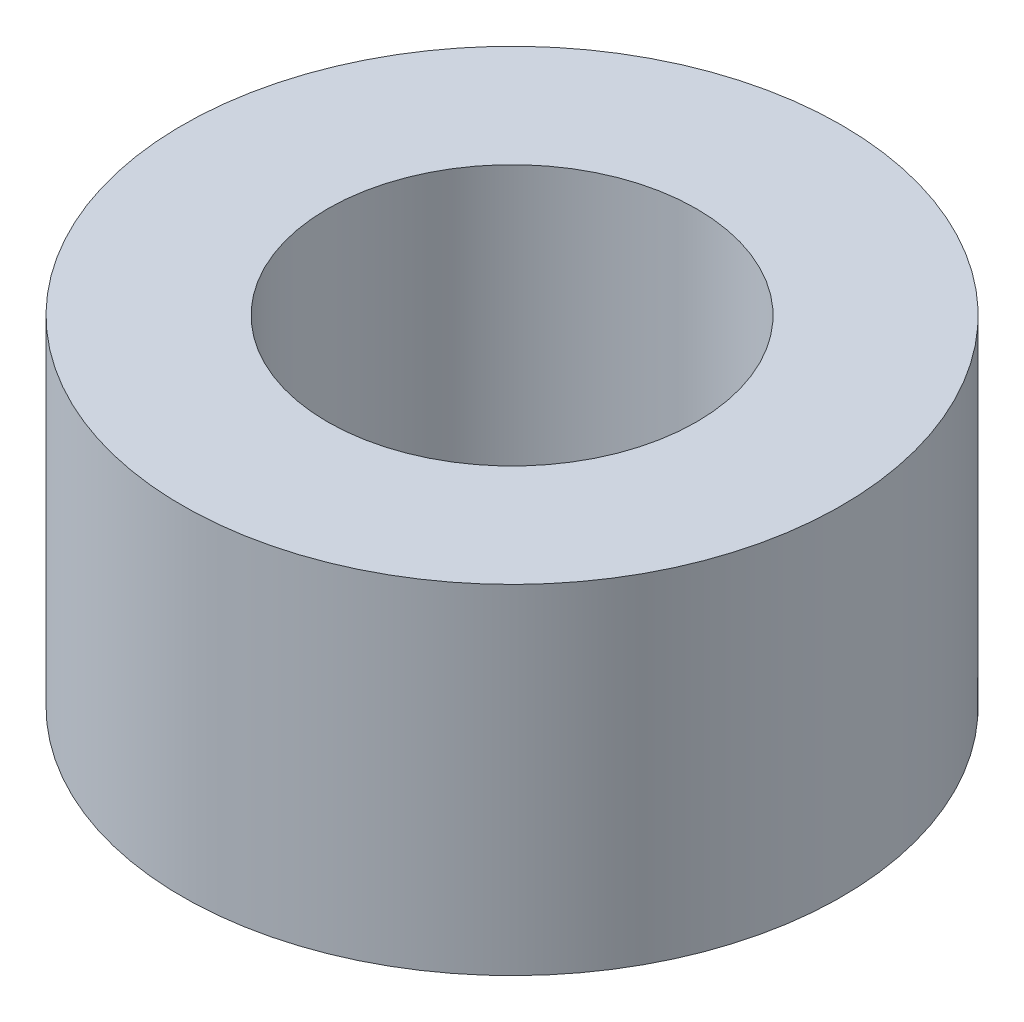
ISO-10303-21;
HEADER;
FILE_DESCRIPTION(('STEP AP214'),'2;1');
FILE_NAME('part.step','',(''),(''),'','','');
FILE_SCHEMA(('AUTOMOTIVE_DESIGN { 1 0 10303 214 1 1 1 1 }'));
ENDSEC;
DATA;
#1=APPLICATION_CONTEXT('core data for automotive mechanical design processes');
#2=APPLICATION_PROTOCOL_DEFINITION('international standard','automotive_design',2000,#1);
#3=PRODUCT_CONTEXT('',#1,'mechanical');
#4=PRODUCT('Part','Part','',(#3));
#5=PRODUCT_RELATED_PRODUCT_CATEGORY('part','',(#4));
#6=PRODUCT_DEFINITION_FORMATION('','',#4);
#7=PRODUCT_DEFINITION_CONTEXT('part definition',#1,'design');
#8=PRODUCT_DEFINITION('design','',#6,#7);
#9=PRODUCT_DEFINITION_SHAPE('','',#8);
#10=(LENGTH_UNIT() NAMED_UNIT(*) SI_UNIT(.MILLI.,.METRE.));
#11=(NAMED_UNIT(*) PLANE_ANGLE_UNIT() SI_UNIT($,.RADIAN.));
#12=(NAMED_UNIT(*) SI_UNIT($,.STERADIAN.) SOLID_ANGLE_UNIT());
#13=UNCERTAINTY_MEASURE_WITH_UNIT(LENGTH_MEASURE(1.E-05),#10,'distance_accuracy_value','');
#14=(GEOMETRIC_REPRESENTATION_CONTEXT(3) GLOBAL_UNCERTAINTY_ASSIGNED_CONTEXT((#13)) GLOBAL_UNIT_ASSIGNED_CONTEXT((#10,
#11,#12)) REPRESENTATION_CONTEXT('',''));
#15=CARTESIAN_POINT('',(0.,0.,0.));
#16=DIRECTION('',(0.,0.,1.));
#17=DIRECTION('',(1.,0.,0.));
#18=AXIS2_PLACEMENT_3D('',#15,#16,#17);
#19=CARTESIAN_POINT('',(0.,3.2639,0.));
#20=DIRECTION('',(0.,1.,0.));
#21=DIRECTION('',(0.,0.,1.));
#22=AXIS2_PLACEMENT_3D('',#19,#20,#21);
#23=PLANE('',#22);
#24=CARTESIAN_POINT('',(0.,3.2639,0.));
#25=DIRECTION('',(0.,1.,0.));
#26=DIRECTION('',(0.,0.,1.));
#27=AXIS2_PLACEMENT_3D('',#24,#25,#26);
#28=CIRCLE('',#27,3.175);
#29=CARTESIAN_POINT('',(0.,3.2639,-3.175));
#30=VERTEX_POINT('',#29);
#31=EDGE_CURVE('E10',#30,#30,#28,.T.);
#32=ORIENTED_EDGE('',*,*,#31,.T.);
#33=EDGE_LOOP('',(#32));
#34=FACE_BOUND('',#33,.T.);
#35=CARTESIAN_POINT('',(0.,3.2639,0.));
#36=DIRECTION('',(0.,1.,0.));
#37=DIRECTION('',(0.,0.,1.));
#38=AXIS2_PLACEMENT_3D('',#35,#36,#37);
#39=CIRCLE('',#38,1.778);
#40=CARTESIAN_POINT('',(0.,3.2639,-1.778));
#41=VERTEX_POINT('',#40);
#42=EDGE_CURVE('E44',#41,#41,#39,.T.);
#43=ORIENTED_EDGE('',*,*,#42,.F.);
#44=EDGE_LOOP('',(#43));
#45=FACE_BOUND('',#44,.T.);
#46=ADVANCED_FACE('F33',(#34,#45),#23,.T.);
#47=CARTESIAN_POINT('',(0.,0.,0.));
#48=DIRECTION('',(0.,1.,0.));
#49=DIRECTION('',(0.,0.,1.));
#50=AXIS2_PLACEMENT_3D('',#47,#48,#49);
#51=PLANE('',#50);
#52=CARTESIAN_POINT('',(0.,0.,0.));
#53=DIRECTION('',(0.,1.,0.));
#54=DIRECTION('',(0.,0.,1.));
#55=AXIS2_PLACEMENT_3D('',#52,#53,#54);
#56=CIRCLE('',#55,3.175);
#57=CARTESIAN_POINT('',(0.,0.,-3.175));
#58=VERTEX_POINT('',#57);
#59=EDGE_CURVE('E37',#58,#58,#56,.T.);
#60=ORIENTED_EDGE('',*,*,#59,.F.);
#61=EDGE_LOOP('',(#60));
#62=FACE_BOUND('',#61,.T.);
#63=CARTESIAN_POINT('',(0.,0.,0.));
#64=DIRECTION('',(0.,1.,0.));
#65=DIRECTION('',(0.,0.,1.));
#66=AXIS2_PLACEMENT_3D('',#63,#64,#65);
#67=CIRCLE('',#66,1.778);
#68=CARTESIAN_POINT('',(0.,0.,-1.778));
#69=VERTEX_POINT('',#68);
#70=EDGE_CURVE('E46',#69,#69,#67,.T.);
#71=ORIENTED_EDGE('',*,*,#70,.T.);
#72=EDGE_LOOP('',(#71));
#73=FACE_BOUND('',#72,.T.);
#74=ADVANCED_FACE('F56',(#62,#73),#51,.F.);
#75=CARTESIAN_POINT('',(0.,3.2639,0.));
#76=DIRECTION('',(0.,-1.,0.));
#77=DIRECTION('',(0.,0.,-1.));
#78=AXIS2_PLACEMENT_3D('',#75,#76,#77);
#79=CYLINDRICAL_SURFACE('',#78,3.175);
#80=CARTESIAN_POINT('',(0.,3.2639,-3.175));
#81=CARTESIAN_POINT('',(0.,3.22990104166667,-3.175));
#82=CARTESIAN_POINT('',(0.,3.19590208333333,-3.175));
#83=CARTESIAN_POINT('',(0.,3.12790416666667,-3.175));
#84=CARTESIAN_POINT('',(0.,3.09390520833333,-3.175));
#85=CARTESIAN_POINT('',(0.,3.02590729166667,-3.175));
#86=CARTESIAN_POINT('',(0.,2.99190833333333,-3.175));
#87=CARTESIAN_POINT('',(0.,2.92391041666667,-3.175));
#88=CARTESIAN_POINT('',(0.,2.88991145833333,-3.175));
#89=CARTESIAN_POINT('',(0.,2.82191354166667,-3.175));
#90=CARTESIAN_POINT('',(0.,2.78791458333333,-3.175));
#91=CARTESIAN_POINT('',(0.,2.71991666666667,-3.175));
#92=CARTESIAN_POINT('',(0.,2.68591770833333,-3.175));
#93=CARTESIAN_POINT('',(0.,2.61791979166667,-3.175));
#94=CARTESIAN_POINT('',(0.,2.58392083333333,-3.175));
#95=CARTESIAN_POINT('',(0.,2.51592291666667,-3.175));
#96=CARTESIAN_POINT('',(0.,2.48192395833333,-3.175));
#97=CARTESIAN_POINT('',(0.,2.41392604166667,-3.175));
#98=CARTESIAN_POINT('',(0.,2.37992708333333,-3.175));
#99=CARTESIAN_POINT('',(0.,2.31192916666667,-3.175));
#100=CARTESIAN_POINT('',(0.,2.27793020833333,-3.175));
#101=CARTESIAN_POINT('',(0.,2.20993229166667,-3.175));
#102=CARTESIAN_POINT('',(0.,2.17593333333333,-3.175));
#103=CARTESIAN_POINT('',(0.,2.10793541666667,-3.175));
#104=CARTESIAN_POINT('',(0.,2.07393645833333,-3.175));
#105=CARTESIAN_POINT('',(0.,2.00593854166667,-3.175));
#106=CARTESIAN_POINT('',(0.,1.97193958333333,-3.175));
#107=CARTESIAN_POINT('',(0.,1.90394166666667,-3.175));
#108=CARTESIAN_POINT('',(0.,1.86994270833333,-3.175));
#109=CARTESIAN_POINT('',(0.,1.80194479166667,-3.175));
#110=CARTESIAN_POINT('',(0.,1.76794583333333,-3.175));
#111=CARTESIAN_POINT('',(0.,1.69994791666667,-3.175));
#112=CARTESIAN_POINT('',(0.,1.66594895833333,-3.175));
#113=CARTESIAN_POINT('',(0.,1.59795104166667,-3.175));
#114=CARTESIAN_POINT('',(0.,1.56395208333333,-3.175));
#115=CARTESIAN_POINT('',(0.,1.49595416666667,-3.175));
#116=CARTESIAN_POINT('',(0.,1.46195520833333,-3.175));
#117=CARTESIAN_POINT('',(0.,1.39395729166667,-3.175));
#118=CARTESIAN_POINT('',(0.,1.35995833333333,-3.175));
#119=CARTESIAN_POINT('',(0.,1.29196041666667,-3.175));
#120=CARTESIAN_POINT('',(0.,1.25796145833333,-3.175));
#121=CARTESIAN_POINT('',(0.,1.18996354166667,-3.175));
#122=CARTESIAN_POINT('',(0.,1.15596458333333,-3.175));
#123=CARTESIAN_POINT('',(0.,1.08796666666667,-3.175));
#124=CARTESIAN_POINT('',(0.,1.05396770833333,-3.175));
#125=CARTESIAN_POINT('',(0.,0.985969791666667,-3.175));
#126=CARTESIAN_POINT('',(0.,0.951970833333333,-3.175));
#127=CARTESIAN_POINT('',(0.,0.883972916666667,-3.175));
#128=CARTESIAN_POINT('',(0.,0.849973958333333,-3.175));
#129=CARTESIAN_POINT('',(0.,0.781976041666666,-3.175));
#130=CARTESIAN_POINT('',(0.,0.747977083333333,-3.175));
#131=CARTESIAN_POINT('',(0.,0.679979166666666,-3.175));
#132=CARTESIAN_POINT('',(0.,0.645980208333333,-3.175));
#133=CARTESIAN_POINT('',(0.,0.577982291666666,-3.175));
#134=CARTESIAN_POINT('',(0.,0.543983333333333,-3.175));
#135=CARTESIAN_POINT('',(0.,0.475985416666666,-3.175));
#136=CARTESIAN_POINT('',(0.,0.441986458333333,-3.175));
#137=CARTESIAN_POINT('',(0.,0.373988541666666,-3.175));
#138=CARTESIAN_POINT('',(0.,0.339989583333333,-3.175));
#139=CARTESIAN_POINT('',(0.,0.271991666666666,-3.175));
#140=CARTESIAN_POINT('',(0.,0.237992708333333,-3.175));
#141=CARTESIAN_POINT('',(0.,0.169994791666666,-3.175));
#142=CARTESIAN_POINT('',(0.,0.135995833333333,-3.175));
#143=CARTESIAN_POINT('',(0.,0.0679979166666662,-3.175));
#144=CARTESIAN_POINT('',(0.,0.0339989583333328,-3.175));
#145=CARTESIAN_POINT('',(0.,0.,-3.175));
#146=B_SPLINE_CURVE_WITH_KNOTS('',3,(#80,#81,#82,#83,#84,#85,#86,#87,#88,#89,#90,#91,#92,#93,
#94,#95,#96,#97,#98,#99,#100,#101,#102,#103,#104,#105,#106,#107,#108,#109,#110,#111,#112,#113,
#114,#115,#116,#117,#118,#119,#120,#121,#122,#123,#124,#125,#126,#127,#128,#129,#130,#131,#132,
#133,#134,#135,#136,#137,#138,#139,#140,#141,#142,#143,#144,#145),.UNSPECIFIED.,.F.,.F.,(4,2,2,
2,2,2,2,2,2,2,2,2,2,2,2,2,2,2,2,2,2,2,2,2,2,2,2,2,2,2,2,2,4),(0.,0.101996875,0.20399375,
0.305990625,0.4079875,0.509984375,0.61198125,0.713978125,0.815975,0.917971875,1.01996875,
1.121965625,1.2239625,1.325959375,1.42795625,1.529953125,1.63195,1.733946875,1.83594375,
1.937940625,2.0399375,2.141934375,2.24393125,2.345928125,2.447925,2.549921875,2.65191875,
2.753915625,2.8559125,2.957909375,3.05990625,3.161903125,3.2639),.UNSPECIFIED.);
#147=EDGE_CURVE('BSEAM35',#30,#58,#146,.T.);
#148=ORIENTED_EDGE('',*,*,#31,.F.);
#149=ORIENTED_EDGE('',*,*,#59,.T.);
#150=ORIENTED_EDGE('',*,*,#147,.T.);
#151=ORIENTED_EDGE('',*,*,#147,.F.);
#152=EDGE_LOOP('',(#148,#150,#149,#151));
#153=FACE_BOUND('',#152,.T.);
#154=ADVANCED_FACE('F35',(#153),#79,.T.);
#155=CARTESIAN_POINT('',(0.,3.2639,0.));
#156=DIRECTION('',(0.,-1.,0.));
#157=DIRECTION('',(0.,0.,-1.));
#158=AXIS2_PLACEMENT_3D('',#155,#156,#157);
#159=CYLINDRICAL_SURFACE('',#158,1.778);
#160=CARTESIAN_POINT('',(0.,3.2639,-1.778));
#161=CARTESIAN_POINT('',(0.,3.22990104166667,-1.778));
#162=CARTESIAN_POINT('',(0.,3.19590208333333,-1.778));
#163=CARTESIAN_POINT('',(0.,3.12790416666667,-1.778));
#164=CARTESIAN_POINT('',(0.,3.09390520833333,-1.778));
#165=CARTESIAN_POINT('',(0.,3.02590729166667,-1.778));
#166=CARTESIAN_POINT('',(0.,2.99190833333333,-1.778));
#167=CARTESIAN_POINT('',(0.,2.92391041666667,-1.778));
#168=CARTESIAN_POINT('',(0.,2.88991145833333,-1.778));
#169=CARTESIAN_POINT('',(0.,2.82191354166667,-1.778));
#170=CARTESIAN_POINT('',(0.,2.78791458333333,-1.778));
#171=CARTESIAN_POINT('',(0.,2.71991666666667,-1.778));
#172=CARTESIAN_POINT('',(0.,2.68591770833333,-1.778));
#173=CARTESIAN_POINT('',(0.,2.61791979166667,-1.778));
#174=CARTESIAN_POINT('',(0.,2.58392083333333,-1.778));
#175=CARTESIAN_POINT('',(0.,2.51592291666667,-1.778));
#176=CARTESIAN_POINT('',(0.,2.48192395833333,-1.778));
#177=CARTESIAN_POINT('',(0.,2.41392604166667,-1.778));
#178=CARTESIAN_POINT('',(0.,2.37992708333333,-1.778));
#179=CARTESIAN_POINT('',(0.,2.31192916666667,-1.778));
#180=CARTESIAN_POINT('',(0.,2.27793020833333,-1.778));
#181=CARTESIAN_POINT('',(0.,2.20993229166667,-1.778));
#182=CARTESIAN_POINT('',(0.,2.17593333333333,-1.778));
#183=CARTESIAN_POINT('',(0.,2.10793541666667,-1.778));
#184=CARTESIAN_POINT('',(0.,2.07393645833333,-1.778));
#185=CARTESIAN_POINT('',(0.,2.00593854166667,-1.778));
#186=CARTESIAN_POINT('',(0.,1.97193958333333,-1.778));
#187=CARTESIAN_POINT('',(0.,1.90394166666667,-1.778));
#188=CARTESIAN_POINT('',(0.,1.86994270833333,-1.778));
#189=CARTESIAN_POINT('',(0.,1.80194479166667,-1.778));
#190=CARTESIAN_POINT('',(0.,1.76794583333333,-1.778));
#191=CARTESIAN_POINT('',(0.,1.69994791666667,-1.778));
#192=CARTESIAN_POINT('',(0.,1.66594895833333,-1.778));
#193=CARTESIAN_POINT('',(0.,1.59795104166667,-1.778));
#194=CARTESIAN_POINT('',(0.,1.56395208333333,-1.778));
#195=CARTESIAN_POINT('',(0.,1.49595416666667,-1.778));
#196=CARTESIAN_POINT('',(0.,1.46195520833333,-1.778));
#197=CARTESIAN_POINT('',(0.,1.39395729166667,-1.778));
#198=CARTESIAN_POINT('',(0.,1.35995833333333,-1.778));
#199=CARTESIAN_POINT('',(0.,1.29196041666667,-1.778));
#200=CARTESIAN_POINT('',(0.,1.25796145833333,-1.778));
#201=CARTESIAN_POINT('',(0.,1.18996354166667,-1.778));
#202=CARTESIAN_POINT('',(0.,1.15596458333333,-1.778));
#203=CARTESIAN_POINT('',(0.,1.08796666666667,-1.778));
#204=CARTESIAN_POINT('',(0.,1.05396770833333,-1.778));
#205=CARTESIAN_POINT('',(0.,0.985969791666667,-1.778));
#206=CARTESIAN_POINT('',(0.,0.951970833333333,-1.778));
#207=CARTESIAN_POINT('',(0.,0.883972916666667,-1.778));
#208=CARTESIAN_POINT('',(0.,0.849973958333333,-1.778));
#209=CARTESIAN_POINT('',(0.,0.781976041666666,-1.778));
#210=CARTESIAN_POINT('',(0.,0.747977083333333,-1.778));
#211=CARTESIAN_POINT('',(0.,0.679979166666666,-1.778));
#212=CARTESIAN_POINT('',(0.,0.645980208333333,-1.778));
#213=CARTESIAN_POINT('',(0.,0.577982291666666,-1.778));
#214=CARTESIAN_POINT('',(0.,0.543983333333333,-1.778));
#215=CARTESIAN_POINT('',(0.,0.475985416666666,-1.778));
#216=CARTESIAN_POINT('',(0.,0.441986458333333,-1.778));
#217=CARTESIAN_POINT('',(0.,0.373988541666666,-1.778));
#218=CARTESIAN_POINT('',(0.,0.339989583333333,-1.778));
#219=CARTESIAN_POINT('',(0.,0.271991666666666,-1.778));
#220=CARTESIAN_POINT('',(0.,0.237992708333333,-1.778));
#221=CARTESIAN_POINT('',(0.,0.169994791666666,-1.778));
#222=CARTESIAN_POINT('',(0.,0.135995833333333,-1.778));
#223=CARTESIAN_POINT('',(0.,0.0679979166666662,-1.778));
#224=CARTESIAN_POINT('',(0.,0.0339989583333328,-1.778));
#225=CARTESIAN_POINT('',(0.,0.,-1.778));
#226=B_SPLINE_CURVE_WITH_KNOTS('',3,(#160,#161,#162,#163,#164,#165,#166,#167,#168,#169,#170,
#171,#172,#173,#174,#175,#176,#177,#178,#179,#180,#181,#182,#183,#184,#185,#186,#187,#188,#189,
#190,#191,#192,#193,#194,#195,#196,#197,#198,#199,#200,#201,#202,#203,#204,#205,#206,#207,#208,
#209,#210,#211,#212,#213,#214,#215,#216,#217,#218,#219,#220,#221,#222,#223,#224,#225),
.UNSPECIFIED.,.F.,.F.,(4,2,2,2,2,2,2,2,2,2,2,2,2,2,2,2,2,2,2,2,2,2,2,2,2,2,2,2,2,2,2,2,4),(0.,
0.101996875,0.20399375,0.305990625,0.4079875,0.509984375,0.61198125,0.713978125,0.815975,
0.917971875,1.01996875,1.121965625,1.2239625,1.325959375,1.42795625,1.529953125,1.63195,
1.733946875,1.83594375,1.937940625,2.0399375,2.141934375,2.24393125,2.345928125,2.447925,
2.549921875,2.65191875,2.753915625,2.8559125,2.957909375,3.05990625,3.161903125,3.2639),.UNSPECIFIED.);
#227=EDGE_CURVE('BSEAM52',#41,#69,#226,.T.);
#228=ORIENTED_EDGE('',*,*,#42,.T.);
#229=ORIENTED_EDGE('',*,*,#70,.F.);
#230=ORIENTED_EDGE('',*,*,#227,.T.);
#231=ORIENTED_EDGE('',*,*,#227,.F.);
#232=EDGE_LOOP('',(#228,#230,#229,#231));
#233=FACE_BOUND('',#232,.T.);
#234=ADVANCED_FACE('F52',(#233),#159,.F.);
#235=CLOSED_SHELL('',(#46,#74,#154,#234));
#236=MANIFOLD_SOLID_BREP('B2',#235);
#237=ADVANCED_BREP_SHAPE_REPRESENTATION('',(#18,#236),#14);
#238=SHAPE_DEFINITION_REPRESENTATION(#9,#237);
ENDSEC;
END-ISO-10303-21;
